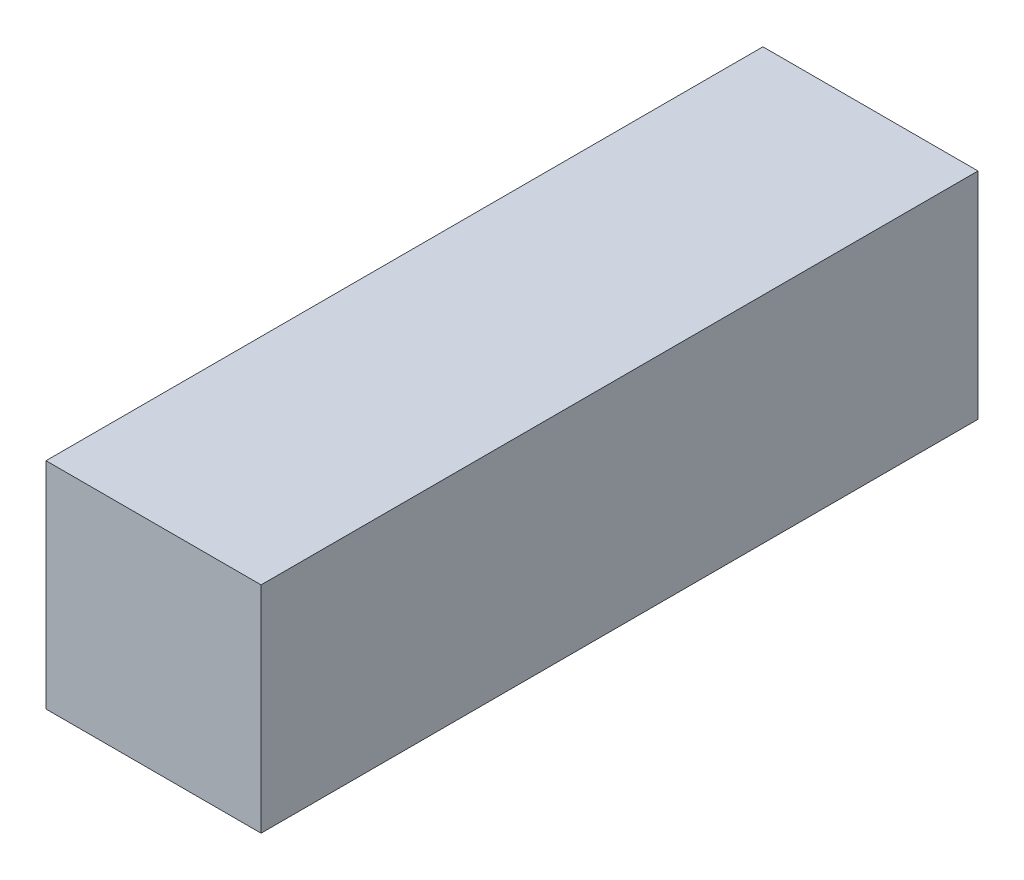
ISO-10303-21;
HEADER;
FILE_DESCRIPTION(('STEP AP214'),'2;1');
FILE_NAME('part.step','',(''),(''),'','','');
FILE_SCHEMA(('AUTOMOTIVE_DESIGN { 1 0 10303 214 1 1 1 1 }'));
ENDSEC;
DATA;
#1=APPLICATION_CONTEXT('core data for automotive mechanical design processes');
#2=APPLICATION_PROTOCOL_DEFINITION('international standard','automotive_design',2000,#1);
#3=PRODUCT_CONTEXT('',#1,'mechanical');
#4=PRODUCT('Part','Part','',(#3));
#5=PRODUCT_RELATED_PRODUCT_CATEGORY('part','',(#4));
#6=PRODUCT_DEFINITION_FORMATION('','',#4);
#7=PRODUCT_DEFINITION_CONTEXT('part definition',#1,'design');
#8=PRODUCT_DEFINITION('design','',#6,#7);
#9=PRODUCT_DEFINITION_SHAPE('','',#8);
#10=(LENGTH_UNIT() NAMED_UNIT(*) SI_UNIT(.MILLI.,.METRE.));
#11=(NAMED_UNIT(*) PLANE_ANGLE_UNIT() SI_UNIT($,.RADIAN.));
#12=(NAMED_UNIT(*) SI_UNIT($,.STERADIAN.) SOLID_ANGLE_UNIT());
#13=UNCERTAINTY_MEASURE_WITH_UNIT(LENGTH_MEASURE(1.E-05),#10,'distance_accuracy_value','');
#14=(GEOMETRIC_REPRESENTATION_CONTEXT(3) GLOBAL_UNCERTAINTY_ASSIGNED_CONTEXT((#13)) GLOBAL_UNIT_ASSIGNED_CONTEXT((#10,
#11,#12)) REPRESENTATION_CONTEXT('',''));
#15=CARTESIAN_POINT('',(0.,0.,0.));
#16=DIRECTION('',(0.,0.,1.));
#17=DIRECTION('',(1.,0.,0.));
#18=AXIS2_PLACEMENT_3D('',#15,#16,#17);
#19=CARTESIAN_POINT('',(1.5,-1.5,5.));
#20=DIRECTION('',(0.,1.,0.));
#21=DIRECTION('',(-1.,0.,0.));
#22=AXIS2_PLACEMENT_3D('',#19,#20,#21);
#23=PLANE('',#22);
#24=DIRECTION('',(0.,0.,-1.));
#25=VECTOR('',#24,1.);
#26=CARTESIAN_POINT('',(-1.5,-1.5,5.));
#27=LINE('',#26,#25);
#28=CARTESIAN_POINT('',(-1.5,-1.5,5.));
#29=VERTEX_POINT('',#28);
#30=CARTESIAN_POINT('',(-1.5,-1.5,-5.));
#31=VERTEX_POINT('',#30);
#32=EDGE_CURVE('E91',#29,#31,#27,.T.);
#33=ORIENTED_EDGE('',*,*,#32,.T.);
#34=DIRECTION('',(1.,0.,0.));
#35=VECTOR('',#34,1.);
#36=CARTESIAN_POINT('',(1.5,-1.5,-5.));
#37=LINE('',#36,#35);
#38=CARTESIAN_POINT('',(1.5,-1.5,-5.));
#39=VERTEX_POINT('',#38);
#40=EDGE_CURVE('E86',#31,#39,#37,.T.);
#41=ORIENTED_EDGE('',*,*,#40,.T.);
#42=DIRECTION('',(0.,0.,-1.));
#43=VECTOR('',#42,1.);
#44=CARTESIAN_POINT('',(1.5,-1.5,5.));
#45=LINE('',#44,#43);
#46=CARTESIAN_POINT('',(1.5,-1.5,5.));
#47=VERTEX_POINT('',#46);
#48=EDGE_CURVE('E11',#47,#39,#45,.T.);
#49=ORIENTED_EDGE('',*,*,#48,.F.);
#50=DIRECTION('',(1.,0.,0.));
#51=VECTOR('',#50,1.);
#52=CARTESIAN_POINT('',(1.5,-1.5,5.));
#53=LINE('',#52,#51);
#54=EDGE_CURVE('E97',#29,#47,#53,.T.);
#55=ORIENTED_EDGE('',*,*,#54,.F.);
#56=EDGE_LOOP('',(#33,#41,#49,#55));
#57=FACE_BOUND('',#56,.T.);
#58=ADVANCED_FACE('F34',(#57),#23,.F.);
#59=CARTESIAN_POINT('',(1.5,-1.5,5.));
#60=DIRECTION('',(-1.,0.,0.));
#61=DIRECTION('',(0.,0.,1.));
#62=AXIS2_PLACEMENT_3D('',#59,#60,#61);
#63=PLANE('',#62);
#64=ORIENTED_EDGE('',*,*,#48,.T.);
#65=DIRECTION('',(0.,1.,0.));
#66=VECTOR('',#65,1.);
#67=CARTESIAN_POINT('',(1.5,-1.5,-5.));
#68=LINE('',#67,#66);
#69=CARTESIAN_POINT('',(1.5,1.5,-5.));
#70=VERTEX_POINT('',#69);
#71=EDGE_CURVE('E76',#39,#70,#68,.T.);
#72=ORIENTED_EDGE('',*,*,#71,.T.);
#73=DIRECTION('',(0.,0.,-1.));
#74=VECTOR('',#73,1.);
#75=CARTESIAN_POINT('',(1.5,1.5,5.));
#76=LINE('',#75,#74);
#77=CARTESIAN_POINT('',(1.5,1.5,5.));
#78=VERTEX_POINT('',#77);
#79=EDGE_CURVE('E41',#78,#70,#76,.T.);
#80=ORIENTED_EDGE('',*,*,#79,.F.);
#81=DIRECTION('',(0.,1.,0.));
#82=VECTOR('',#81,1.);
#83=CARTESIAN_POINT('',(1.5,-1.5,5.));
#84=LINE('',#83,#82);
#85=EDGE_CURVE('E77',#47,#78,#84,.T.);
#86=ORIENTED_EDGE('',*,*,#85,.F.);
#87=EDGE_LOOP('',(#64,#72,#80,#86));
#88=FACE_BOUND('',#87,.T.);
#89=ADVANCED_FACE('F74',(#88),#63,.F.);
#90=CARTESIAN_POINT('',(1.5,1.5,5.));
#91=DIRECTION('',(0.,-1.,0.));
#92=DIRECTION('',(1.,0.,0.));
#93=AXIS2_PLACEMENT_3D('',#90,#91,#92);
#94=PLANE('',#93);
#95=ORIENTED_EDGE('',*,*,#79,.T.);
#96=DIRECTION('',(-1.,0.,0.));
#97=VECTOR('',#96,1.);
#98=CARTESIAN_POINT('',(1.5,1.5,-5.));
#99=LINE('',#98,#97);
#100=CARTESIAN_POINT('',(-1.5,1.5,-5.));
#101=VERTEX_POINT('',#100);
#102=EDGE_CURVE('E89',#70,#101,#99,.T.);
#103=ORIENTED_EDGE('',*,*,#102,.T.);
#104=DIRECTION('',(0.,0.,-1.));
#105=VECTOR('',#104,1.);
#106=CARTESIAN_POINT('',(-1.5,1.5,5.));
#107=LINE('',#106,#105);
#108=CARTESIAN_POINT('',(-1.5,1.5,5.));
#109=VERTEX_POINT('',#108);
#110=EDGE_CURVE('E103',#109,#101,#107,.T.);
#111=ORIENTED_EDGE('',*,*,#110,.F.);
#112=DIRECTION('',(-1.,0.,0.));
#113=VECTOR('',#112,1.);
#114=CARTESIAN_POINT('',(1.5,1.5,5.));
#115=LINE('',#114,#113);
#116=EDGE_CURVE('E53',#78,#109,#115,.T.);
#117=ORIENTED_EDGE('',*,*,#116,.F.);
#118=EDGE_LOOP('',(#95,#103,#111,#117));
#119=FACE_BOUND('',#118,.T.);
#120=ADVANCED_FACE('F105',(#119),#94,.F.);
#121=CARTESIAN_POINT('',(-1.5,-1.5,5.));
#122=DIRECTION('',(1.,0.,0.));
#123=DIRECTION('',(0.,1.,0.));
#124=AXIS2_PLACEMENT_3D('',#121,#122,#123);
#125=PLANE('',#124);
#126=ORIENTED_EDGE('',*,*,#110,.T.);
#127=DIRECTION('',(0.,-1.,0.));
#128=VECTOR('',#127,1.);
#129=CARTESIAN_POINT('',(-1.5,-1.5,-5.));
#130=LINE('',#129,#128);
#131=EDGE_CURVE('E95',#101,#31,#130,.T.);
#132=ORIENTED_EDGE('',*,*,#131,.T.);
#133=ORIENTED_EDGE('',*,*,#32,.F.);
#134=DIRECTION('',(0.,-1.,0.));
#135=VECTOR('',#134,1.);
#136=CARTESIAN_POINT('',(-1.5,-1.5,5.));
#137=LINE('',#136,#135);
#138=EDGE_CURVE('E48',#109,#29,#137,.T.);
#139=ORIENTED_EDGE('',*,*,#138,.F.);
#140=EDGE_LOOP('',(#126,#132,#133,#139));
#141=FACE_BOUND('',#140,.T.);
#142=ADVANCED_FACE('F107',(#141),#125,.F.);
#143=CARTESIAN_POINT('',(0.,0.,5.));
#144=DIRECTION('',(0.,0.,-1.));
#145=DIRECTION('',(-1.,0.,0.));
#146=AXIS2_PLACEMENT_3D('',#143,#144,#145);
#147=PLANE('',#146);
#148=ORIENTED_EDGE('',*,*,#54,.T.);
#149=ORIENTED_EDGE('',*,*,#85,.T.);
#150=ORIENTED_EDGE('',*,*,#116,.T.);
#151=ORIENTED_EDGE('',*,*,#138,.T.);
#152=EDGE_LOOP('',(#148,#149,#150,#151));
#153=FACE_BOUND('',#152,.T.);
#154=ADVANCED_FACE('F108',(#153),#147,.F.);
#155=CARTESIAN_POINT('',(0.,0.,-5.));
#156=DIRECTION('',(0.,0.,-1.));
#157=DIRECTION('',(-1.,0.,0.));
#158=AXIS2_PLACEMENT_3D('',#155,#156,#157);
#159=PLANE('',#158);
#160=ORIENTED_EDGE('',*,*,#40,.F.);
#161=ORIENTED_EDGE('',*,*,#131,.F.);
#162=ORIENTED_EDGE('',*,*,#102,.F.);
#163=ORIENTED_EDGE('',*,*,#71,.F.);
#164=EDGE_LOOP('',(#160,#161,#162,#163));
#165=FACE_BOUND('',#164,.T.);
#166=ADVANCED_FACE('F84',(#165),#159,.T.);
#167=CLOSED_SHELL('',(#58,#89,#120,#142,#154,#166));
#168=MANIFOLD_SOLID_BREP('B2',#167);
#169=ADVANCED_BREP_SHAPE_REPRESENTATION('',(#18,#168),#14);
#170=SHAPE_DEFINITION_REPRESENTATION(#9,#169);
ENDSEC;
END-ISO-10303-21;
